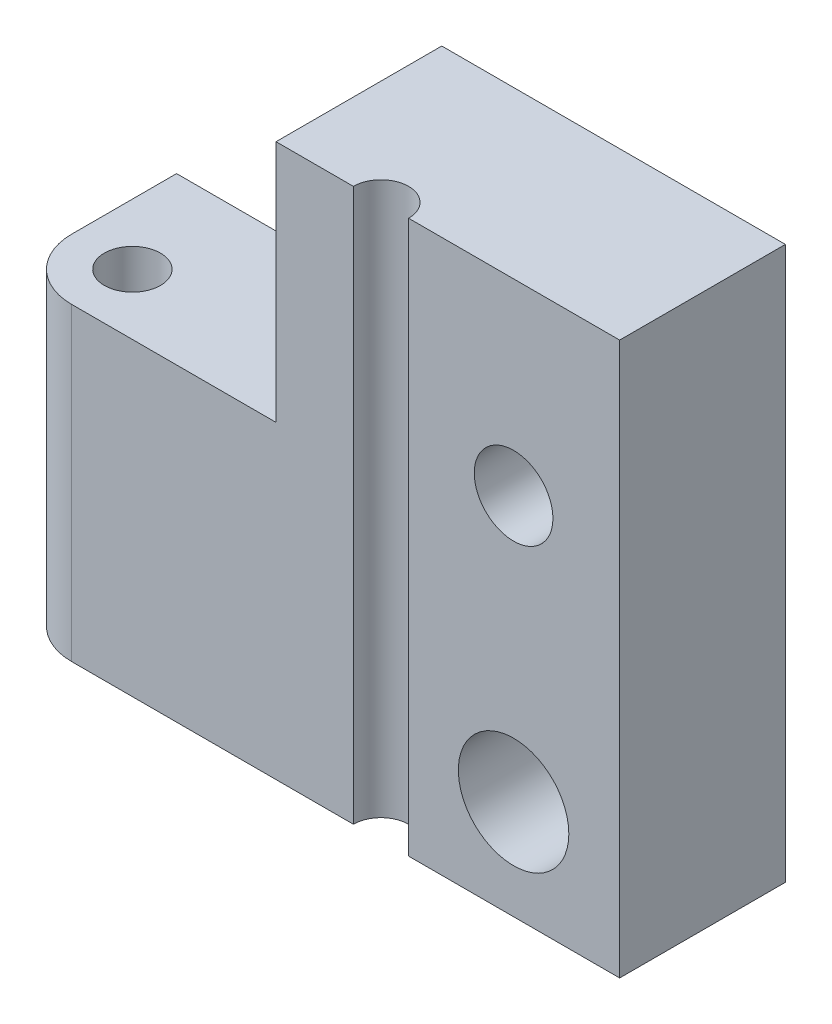
ISO-10303-21;
HEADER;
FILE_DESCRIPTION(('STEP AP214'),'2;1');
FILE_NAME('part.step','',(''),(''),'','','');
FILE_SCHEMA(('AUTOMOTIVE_DESIGN { 1 0 10303 214 1 1 1 1 }'));
ENDSEC;
DATA;
#1=APPLICATION_CONTEXT('core data for automotive mechanical design processes');
#2=APPLICATION_PROTOCOL_DEFINITION('international standard','automotive_design',2000,#1);
#3=PRODUCT_CONTEXT('',#1,'mechanical');
#4=PRODUCT('Part','Part','',(#3));
#5=PRODUCT_RELATED_PRODUCT_CATEGORY('part','',(#4));
#6=PRODUCT_DEFINITION_FORMATION('','',#4);
#7=PRODUCT_DEFINITION_CONTEXT('part definition',#1,'design');
#8=PRODUCT_DEFINITION('design','',#6,#7);
#9=PRODUCT_DEFINITION_SHAPE('','',#8);
#10=(LENGTH_UNIT() NAMED_UNIT(*) SI_UNIT(.MILLI.,.METRE.));
#11=(NAMED_UNIT(*) PLANE_ANGLE_UNIT() SI_UNIT($,.RADIAN.));
#12=(NAMED_UNIT(*) SI_UNIT($,.STERADIAN.) SOLID_ANGLE_UNIT());
#13=UNCERTAINTY_MEASURE_WITH_UNIT(LENGTH_MEASURE(1.E-05),#10,'distance_accuracy_value','');
#14=(GEOMETRIC_REPRESENTATION_CONTEXT(3) GLOBAL_UNCERTAINTY_ASSIGNED_CONTEXT((#13)) GLOBAL_UNIT_ASSIGNED_CONTEXT((#10,
#11,#12)) REPRESENTATION_CONTEXT('',''));
#15=CARTESIAN_POINT('',(0.,0.,0.));
#16=DIRECTION('',(0.,0.,1.));
#17=DIRECTION('',(1.,0.,0.));
#18=AXIS2_PLACEMENT_3D('',#15,#16,#17);
#19=CARTESIAN_POINT('',(17.49425,15.875,0.));
#20=DIRECTION('',(-1.,0.,0.));
#21=DIRECTION('',(0.,0.,1.));
#22=AXIS2_PLACEMENT_3D('',#19,#20,#21);
#23=PLANE('',#22);
#24=DIRECTION('',(0.,0.,-1.));
#25=VECTOR('',#24,1.);
#26=CARTESIAN_POINT('',(17.49425,0.,0.));
#27=LINE('',#26,#25);
#28=CARTESIAN_POINT('',(17.49425,0.,0.));
#29=VERTEX_POINT('',#28);
#30=CARTESIAN_POINT('',(17.49425,0.,-4.7625));
#31=VERTEX_POINT('',#30);
#32=EDGE_CURVE('E119',#29,#31,#27,.T.);
#33=ORIENTED_EDGE('',*,*,#32,.T.);
#34=DIRECTION('',(0.,-1.,0.));
#35=VECTOR('',#34,1.);
#36=CARTESIAN_POINT('',(17.49425,15.875,-4.7625));
#37=LINE('',#36,#35);
#38=CARTESIAN_POINT('',(17.49425,15.875,-4.7625));
#39=VERTEX_POINT('',#38);
#40=EDGE_CURVE('E123',#39,#31,#37,.T.);
#41=ORIENTED_EDGE('',*,*,#40,.F.);
#42=DIRECTION('',(0.,0.,-1.));
#43=VECTOR('',#42,1.);
#44=CARTESIAN_POINT('',(17.49425,15.875,0.));
#45=LINE('',#44,#43);
#46=CARTESIAN_POINT('',(17.49425,15.875,0.));
#47=VERTEX_POINT('',#46);
#48=EDGE_CURVE('E196',#47,#39,#45,.T.);
#49=ORIENTED_EDGE('',*,*,#48,.F.);
#50=DIRECTION('',(0.,-1.,0.));
#51=VECTOR('',#50,1.);
#52=CARTESIAN_POINT('',(17.49425,15.875,0.));
#53=LINE('',#52,#51);
#54=EDGE_CURVE('E124',#47,#29,#53,.T.);
#55=ORIENTED_EDGE('',*,*,#54,.T.);
#56=EDGE_LOOP('',(#33,#41,#49,#55));
#57=FACE_BOUND('',#56,.T.);
#58=ADVANCED_FACE('F40',(#57),#23,.F.);
#59=CARTESIAN_POINT('',(0.,15.875,-1.74625));
#60=DIRECTION('',(1.,0.,0.));
#61=DIRECTION('',(0.,0.,-1.));
#62=AXIS2_PLACEMENT_3D('',#59,#60,#61);
#63=PLANE('',#62);
#64=DIRECTION('',(0.,-1.,0.));
#65=VECTOR('',#64,1.);
#66=CARTESIAN_POINT('',(0.,15.875,-1.74625));
#67=LINE('',#66,#65);
#68=CARTESIAN_POINT('',(0.,8.89,-1.74625));
#69=VERTEX_POINT('',#68);
#70=CARTESIAN_POINT('',(0.,0.,-1.74625));
#71=VERTEX_POINT('',#70);
#72=EDGE_CURVE('E11',#69,#71,#67,.T.);
#73=ORIENTED_EDGE('',*,*,#72,.F.);
#74=DIRECTION('',(0.,0.,-1.));
#75=VECTOR('',#74,1.);
#76=CARTESIAN_POINT('',(0.,8.89,0.));
#77=LINE('',#76,#75);
#78=CARTESIAN_POINT('',(0.,8.89,-4.7625));
#79=VERTEX_POINT('',#78);
#80=EDGE_CURVE('E181',#69,#79,#77,.T.);
#81=ORIENTED_EDGE('',*,*,#80,.T.);
#82=DIRECTION('',(0.,1.,0.));
#83=VECTOR('',#82,1.);
#84=CARTESIAN_POINT('',(0.,0.,-4.7625));
#85=LINE('',#84,#83);
#86=CARTESIAN_POINT('',(0.,0.,-4.7625));
#87=VERTEX_POINT('',#86);
#88=EDGE_CURVE('E139',#87,#79,#85,.T.);
#89=ORIENTED_EDGE('',*,*,#88,.F.);
#90=DIRECTION('',(0.,0.,1.));
#91=VECTOR('',#90,1.);
#92=CARTESIAN_POINT('',(0.,0.,-1.74625));
#93=LINE('',#92,#91);
#94=EDGE_CURVE('E127',#87,#71,#93,.T.);
#95=ORIENTED_EDGE('',*,*,#94,.T.);
#96=EDGE_LOOP('',(#73,#81,#89,#95));
#97=FACE_BOUND('',#96,.T.);
#98=ADVANCED_FACE('F251',(#97),#63,.F.);
#99=CARTESIAN_POINT('',(1.74625,15.875,-1.74625));
#100=DIRECTION('',(0.,-1.,0.));
#101=DIRECTION('',(0.,0.,-1.));
#102=AXIS2_PLACEMENT_3D('',#99,#100,#101);
#103=CYLINDRICAL_SURFACE('',#102,1.74625);
#104=DIRECTION('',(0.,-1.,0.));
#105=VECTOR('',#104,1.);
#106=CARTESIAN_POINT('',(1.74625,15.875,0.));
#107=LINE('',#106,#105);
#108=CARTESIAN_POINT('',(1.74625,8.89,0.));
#109=VERTEX_POINT('',#108);
#110=CARTESIAN_POINT('',(1.74625,0.,0.));
#111=VERTEX_POINT('',#110);
#112=EDGE_CURVE('E49',#109,#111,#107,.T.);
#113=ORIENTED_EDGE('',*,*,#112,.F.);
#114=CARTESIAN_POINT('',(1.74625,8.89,-1.74625));
#115=DIRECTION('',(0.,-1.,0.));
#116=DIRECTION('',(1.,0.,0.));
#117=AXIS2_PLACEMENT_3D('',#114,#115,#116);
#118=CIRCLE('',#117,1.74625);
#119=EDGE_CURVE('E189',#109,#69,#118,.T.);
#120=ORIENTED_EDGE('',*,*,#119,.T.);
#121=ORIENTED_EDGE('',*,*,#72,.T.);
#122=CARTESIAN_POINT('',(1.74625,0.,-1.74625));
#123=DIRECTION('',(0.,1.,0.));
#124=DIRECTION('',(0.,0.,1.));
#125=AXIS2_PLACEMENT_3D('',#122,#123,#124);
#126=CIRCLE('',#125,1.74625);
#127=EDGE_CURVE('E208',#71,#111,#126,.T.);
#128=ORIENTED_EDGE('',*,*,#127,.T.);
#129=EDGE_LOOP('',(#113,#120,#121,#128));
#130=FACE_BOUND('',#129,.T.);
#131=ADVANCED_FACE('F236',(#130),#103,.T.);
#132=CARTESIAN_POINT('',(1.74625,15.875,0.));
#133=DIRECTION('',(0.,0.,-1.));
#134=DIRECTION('',(-1.,0.,0.));
#135=AXIS2_PLACEMENT_3D('',#132,#133,#134);
#136=PLANE('',#135);
#137=DIRECTION('',(0.,-1.,0.));
#138=VECTOR('',#137,1.);
#139=CARTESIAN_POINT('',(7.62,15.875,0.));
#140=LINE('',#139,#138);
#141=CARTESIAN_POINT('',(7.62,15.875,0.));
#142=VERTEX_POINT('',#141);
#143=CARTESIAN_POINT('',(7.62,8.89,0.));
#144=VERTEX_POINT('',#143);
#145=EDGE_CURVE('E56',#142,#144,#140,.T.);
#146=ORIENTED_EDGE('',*,*,#145,.T.);
#147=DIRECTION('',(-1.,0.,0.));
#148=VECTOR('',#147,1.);
#149=CARTESIAN_POINT('',(0.,8.89,0.));
#150=LINE('',#149,#148);
#151=EDGE_CURVE('E176',#144,#109,#150,.T.);
#152=ORIENTED_EDGE('',*,*,#151,.T.);
#153=ORIENTED_EDGE('',*,*,#112,.T.);
#154=DIRECTION('',(1.,0.,0.));
#155=VECTOR('',#154,1.);
#156=CARTESIAN_POINT('',(1.74625,0.,0.));
#157=LINE('',#156,#155);
#158=CARTESIAN_POINT('',(9.8425,0.,0.));
#159=VERTEX_POINT('',#158);
#160=EDGE_CURVE('E212',#111,#159,#157,.T.);
#161=ORIENTED_EDGE('',*,*,#160,.T.);
#162=DIRECTION('',(0.,-1.,0.));
#163=VECTOR('',#162,1.);
#164=CARTESIAN_POINT('',(9.8425,15.875,0.));
#165=LINE('',#164,#163);
#166=CARTESIAN_POINT('',(9.8425,15.875,0.));
#167=VERTEX_POINT('',#166);
#168=EDGE_CURVE('E225',#167,#159,#165,.T.);
#169=ORIENTED_EDGE('',*,*,#168,.F.);
#170=DIRECTION('',(1.,0.,0.));
#171=VECTOR('',#170,1.);
#172=CARTESIAN_POINT('',(1.74625,15.875,0.));
#173=LINE('',#172,#171);
#174=EDGE_CURVE('E91',#142,#167,#173,.T.);
#175=ORIENTED_EDGE('',*,*,#174,.F.);
#176=EDGE_LOOP('',(#146,#152,#153,#161,#169,#175));
#177=FACE_BOUND('',#176,.T.);
#178=ADVANCED_FACE('F232',(#177),#136,.F.);
#179=CARTESIAN_POINT('',(10.63625,15.875,0.));
#180=DIRECTION('',(0.,-1.,0.));
#181=DIRECTION('',(0.,0.,-1.));
#182=AXIS2_PLACEMENT_3D('',#179,#180,#181);
#183=CYLINDRICAL_SURFACE('',#182,0.793749999999999);
#184=CARTESIAN_POINT('',(10.63625,0.,0.));
#185=DIRECTION('',(0.,-1.,0.));
#186=DIRECTION('',(0.,0.,-1.));
#187=AXIS2_PLACEMENT_3D('',#184,#185,#186);
#188=CIRCLE('',#187,0.793749999999999);
#189=CARTESIAN_POINT('',(11.43,0.,0.));
#190=VERTEX_POINT('',#189);
#191=EDGE_CURVE('E215',#159,#190,#188,.T.);
#192=ORIENTED_EDGE('',*,*,#191,.T.);
#193=DIRECTION('',(0.,-1.,0.));
#194=VECTOR('',#193,1.);
#195=CARTESIAN_POINT('',(11.43,15.875,0.));
#196=LINE('',#195,#194);
#197=CARTESIAN_POINT('',(11.43,15.875,0.));
#198=VERTEX_POINT('',#197);
#199=EDGE_CURVE('E222',#198,#190,#196,.T.);
#200=ORIENTED_EDGE('',*,*,#199,.F.);
#201=CARTESIAN_POINT('',(10.63625,15.875,0.));
#202=DIRECTION('',(0.,-1.,0.));
#203=DIRECTION('',(0.,0.,-1.));
#204=AXIS2_PLACEMENT_3D('',#201,#202,#203);
#205=CIRCLE('',#204,0.793749999999999);
#206=EDGE_CURVE('E201',#167,#198,#205,.T.);
#207=ORIENTED_EDGE('',*,*,#206,.F.);
#208=ORIENTED_EDGE('',*,*,#168,.T.);
#209=EDGE_LOOP('',(#192,#200,#207,#208));
#210=FACE_BOUND('',#209,.T.);
#211=ADVANCED_FACE('F241',(#210),#183,.F.);
#212=CARTESIAN_POINT('',(11.43,15.875,0.));
#213=DIRECTION('',(0.,0.,-1.));
#214=DIRECTION('',(-1.,0.,0.));
#215=AXIS2_PLACEMENT_3D('',#212,#213,#214);
#216=PLANE('',#215);
#217=CARTESIAN_POINT('',(14.44625,10.4775,0.));
#218=DIRECTION('',(0.,0.,1.));
#219=DIRECTION('',(1.,0.,0.));
#220=AXIS2_PLACEMENT_3D('',#217,#218,#219);
#221=CIRCLE('',#220,1.1303);
#222=CARTESIAN_POINT('',(15.57655,10.4775,0.));
#223=VERTEX_POINT('',#222);
#224=EDGE_CURVE('E151',#223,#223,#221,.T.);
#225=ORIENTED_EDGE('',*,*,#224,.F.);
#226=EDGE_LOOP('',(#225));
#227=FACE_BOUND('',#226,.T.);
#228=CARTESIAN_POINT('',(14.44625,2.8575,0.));
#229=DIRECTION('',(0.,0.,1.));
#230=DIRECTION('',(1.,0.,0.));
#231=AXIS2_PLACEMENT_3D('',#228,#229,#230);
#232=CIRCLE('',#231,1.5875);
#233=CARTESIAN_POINT('',(16.03375,2.8575,0.));
#234=VERTEX_POINT('',#233);
#235=EDGE_CURVE('E166',#234,#234,#232,.T.);
#236=ORIENTED_EDGE('',*,*,#235,.F.);
#237=EDGE_LOOP('',(#236));
#238=FACE_BOUND('',#237,.T.);
#239=DIRECTION('',(1.,0.,0.));
#240=VECTOR('',#239,1.);
#241=CARTESIAN_POINT('',(11.43,0.,0.));
#242=LINE('',#241,#240);
#243=EDGE_CURVE('E87',#190,#29,#242,.T.);
#244=ORIENTED_EDGE('',*,*,#243,.T.);
#245=ORIENTED_EDGE('',*,*,#54,.F.);
#246=DIRECTION('',(1.,0.,0.));
#247=VECTOR('',#246,1.);
#248=CARTESIAN_POINT('',(11.43,15.875,0.));
#249=LINE('',#248,#247);
#250=EDGE_CURVE('E65',#198,#47,#249,.T.);
#251=ORIENTED_EDGE('',*,*,#250,.F.);
#252=ORIENTED_EDGE('',*,*,#199,.T.);
#253=EDGE_LOOP('',(#244,#245,#251,#252));
#254=FACE_BOUND('',#253,.T.);
#255=ADVANCED_FACE('F243',(#227,#238,#254),#216,.F.);
#256=CARTESIAN_POINT('',(1.74625,15.875,-1.74625));
#257=DIRECTION('',(0.,1.,0.));
#258=DIRECTION('',(0.,0.,1.));
#259=AXIS2_PLACEMENT_3D('',#256,#257,#258);
#260=PLANE('',#259);
#261=DIRECTION('',(0.,0.,-1.));
#262=VECTOR('',#261,1.);
#263=CARTESIAN_POINT('',(7.62,15.875,0.));
#264=LINE('',#263,#262);
#265=CARTESIAN_POINT('',(7.62,15.875,-4.7625));
#266=VERTEX_POINT('',#265);
#267=EDGE_CURVE('E180',#142,#266,#264,.T.);
#268=ORIENTED_EDGE('',*,*,#267,.F.);
#269=ORIENTED_EDGE('',*,*,#174,.T.);
#270=ORIENTED_EDGE('',*,*,#206,.T.);
#271=ORIENTED_EDGE('',*,*,#250,.T.);
#272=ORIENTED_EDGE('',*,*,#48,.T.);
#273=DIRECTION('',(1.,0.,0.));
#274=VECTOR('',#273,1.);
#275=CARTESIAN_POINT('',(7.62,15.875,-4.7625));
#276=LINE('',#275,#274);
#277=EDGE_CURVE('E145',#266,#39,#276,.T.);
#278=ORIENTED_EDGE('',*,*,#277,.F.);
#279=EDGE_LOOP('',(#268,#269,#270,#271,#272,#278));
#280=FACE_BOUND('',#279,.T.);
#281=ADVANCED_FACE('F244',(#280),#260,.T.);
#282=CARTESIAN_POINT('',(1.74625,0.,-1.74625));
#283=DIRECTION('',(0.,1.,0.));
#284=DIRECTION('',(0.,0.,1.));
#285=AXIS2_PLACEMENT_3D('',#282,#283,#284);
#286=PLANE('',#285);
#287=CARTESIAN_POINT('',(1.74625,0.,-1.74625));
#288=DIRECTION('',(0.,1.,0.));
#289=DIRECTION('',(0.,0.,1.));
#290=AXIS2_PLACEMENT_3D('',#287,#288,#289);
#291=CIRCLE('',#290,0.806449999999997);
#292=CARTESIAN_POINT('',(1.74625,0.,-0.939800000000003));
#293=VERTEX_POINT('',#292);
#294=EDGE_CURVE('E128',#293,#293,#291,.T.);
#295=ORIENTED_EDGE('',*,*,#294,.T.);
#296=EDGE_LOOP('',(#295));
#297=FACE_BOUND('',#296,.T.);
#298=ORIENTED_EDGE('',*,*,#32,.F.);
#299=ORIENTED_EDGE('',*,*,#243,.F.);
#300=ORIENTED_EDGE('',*,*,#191,.F.);
#301=ORIENTED_EDGE('',*,*,#160,.F.);
#302=ORIENTED_EDGE('',*,*,#127,.F.);
#303=ORIENTED_EDGE('',*,*,#94,.F.);
#304=DIRECTION('',(-1.,0.,0.));
#305=VECTOR('',#304,1.);
#306=CARTESIAN_POINT('',(17.49425,0.,-4.7625));
#307=LINE('',#306,#305);
#308=EDGE_CURVE('E131',#31,#87,#307,.T.);
#309=ORIENTED_EDGE('',*,*,#308,.F.);
#310=EDGE_LOOP('',(#298,#299,#300,#301,#302,#303,#309));
#311=FACE_BOUND('',#310,.T.);
#312=ADVANCED_FACE('F132',(#297,#311),#286,.F.);
#313=CARTESIAN_POINT('',(1.74625,15.875,-1.74625));
#314=DIRECTION('',(0.,1.,0.));
#315=DIRECTION('',(0.,0.,1.));
#316=AXIS2_PLACEMENT_3D('',#313,#314,#315);
#317=CYLINDRICAL_SURFACE('',#316,0.806449999999992);
#318=CARTESIAN_POINT('',(1.74625,8.89,-1.74625));
#319=DIRECTION('',(0.,-1.,0.));
#320=DIRECTION('',(1.,0.,0.));
#321=AXIS2_PLACEMENT_3D('',#318,#319,#320);
#322=CIRCLE('',#321,0.806449999999992);
#323=CARTESIAN_POINT('',(2.55269999999999,8.89,-1.74625));
#324=VERTEX_POINT('',#323);
#325=EDGE_CURVE('E43',#324,#324,#322,.F.);
#326=ORIENTED_EDGE('',*,*,#325,.T.);
#327=EDGE_LOOP('',(#326));
#328=FACE_BOUND('',#327,.T.);
#329=ORIENTED_EDGE('',*,*,#294,.F.);
#330=EDGE_LOOP('',(#329));
#331=FACE_BOUND('',#330,.T.);
#332=ADVANCED_FACE('F268',(#328,#331),#317,.F.);
#333=CARTESIAN_POINT('',(0.,8.89,0.));
#334=DIRECTION('',(0.,-1.,0.));
#335=DIRECTION('',(1.,0.,0.));
#336=AXIS2_PLACEMENT_3D('',#333,#334,#335);
#337=PLANE('',#336);
#338=ORIENTED_EDGE('',*,*,#325,.F.);
#339=EDGE_LOOP('',(#338));
#340=FACE_BOUND('',#339,.T.);
#341=ORIENTED_EDGE('',*,*,#151,.F.);
#342=DIRECTION('',(0.,0.,-1.));
#343=VECTOR('',#342,1.);
#344=CARTESIAN_POINT('',(7.62,8.89,0.));
#345=LINE('',#344,#343);
#346=CARTESIAN_POINT('',(7.62,8.89,-4.7625));
#347=VERTEX_POINT('',#346);
#348=EDGE_CURVE('E184',#144,#347,#345,.T.);
#349=ORIENTED_EDGE('',*,*,#348,.T.);
#350=DIRECTION('',(1.,0.,0.));
#351=VECTOR('',#350,1.);
#352=CARTESIAN_POINT('',(0.,8.89,-4.7625));
#353=LINE('',#352,#351);
#354=EDGE_CURVE('E157',#79,#347,#353,.T.);
#355=ORIENTED_EDGE('',*,*,#354,.F.);
#356=ORIENTED_EDGE('',*,*,#80,.F.);
#357=ORIENTED_EDGE('',*,*,#119,.F.);
#358=EDGE_LOOP('',(#341,#349,#355,#356,#357));
#359=FACE_BOUND('',#358,.T.);
#360=ADVANCED_FACE('F249',(#340,#359),#337,.F.);
#361=CARTESIAN_POINT('',(7.62,15.875,0.));
#362=DIRECTION('',(1.,0.,0.));
#363=DIRECTION('',(0.,1.,0.));
#364=AXIS2_PLACEMENT_3D('',#361,#362,#363);
#365=PLANE('',#364);
#366=ORIENTED_EDGE('',*,*,#267,.T.);
#367=DIRECTION('',(0.,1.,0.));
#368=VECTOR('',#367,1.);
#369=CARTESIAN_POINT('',(7.62,8.89,-4.7625));
#370=LINE('',#369,#368);
#371=EDGE_CURVE('E161',#347,#266,#370,.T.);
#372=ORIENTED_EDGE('',*,*,#371,.F.);
#373=ORIENTED_EDGE('',*,*,#348,.F.);
#374=ORIENTED_EDGE('',*,*,#145,.F.);
#375=EDGE_LOOP('',(#366,#372,#373,#374));
#376=FACE_BOUND('',#375,.T.);
#377=ADVANCED_FACE('F246',(#376),#365,.F.);
#378=CARTESIAN_POINT('',(14.44625,2.8575,-3.302));
#379=DIRECTION('',(0.,0.,1.));
#380=DIRECTION('',(1.,0.,0.));
#381=AXIS2_PLACEMENT_3D('',#378,#379,#380);
#382=CYLINDRICAL_SURFACE('',#381,1.5875);
#383=CARTESIAN_POINT('',(14.44625,2.8575,-3.175));
#384=DIRECTION('',(0.,0.,1.));
#385=DIRECTION('',(1.,0.,0.));
#386=AXIS2_PLACEMENT_3D('',#383,#384,#385);
#387=CIRCLE('',#386,1.5875);
#388=CARTESIAN_POINT('',(16.03375,2.8575,-3.175));
#389=VERTEX_POINT('',#388);
#390=EDGE_CURVE('E170',#389,#389,#387,.T.);
#391=CARTESIAN_POINT('',(16.03375,2.8575,0.));
#392=CARTESIAN_POINT('',(16.03375,2.8575,-0.0330729166666666));
#393=CARTESIAN_POINT('',(16.03375,2.8575,-0.0661458333333333));
#394=CARTESIAN_POINT('',(16.03375,2.8575,-0.132291666666667));
#395=CARTESIAN_POINT('',(16.03375,2.8575,-0.165364583333333));
#396=CARTESIAN_POINT('',(16.03375,2.8575,-0.231510416666667));
#397=CARTESIAN_POINT('',(16.03375,2.8575,-0.264583333333333));
#398=CARTESIAN_POINT('',(16.03375,2.8575,-0.330729166666667));
#399=CARTESIAN_POINT('',(16.03375,2.8575,-0.363802083333333));
#400=CARTESIAN_POINT('',(16.03375,2.8575,-0.429947916666667));
#401=CARTESIAN_POINT('',(16.03375,2.8575,-0.463020833333333));
#402=CARTESIAN_POINT('',(16.03375,2.8575,-0.529166666666667));
#403=CARTESIAN_POINT('',(16.03375,2.8575,-0.562239583333334));
#404=CARTESIAN_POINT('',(16.03375,2.8575,-0.628385416666667));
#405=CARTESIAN_POINT('',(16.03375,2.8575,-0.661458333333334));
#406=CARTESIAN_POINT('',(16.03375,2.8575,-0.727604166666667));
#407=CARTESIAN_POINT('',(16.03375,2.8575,-0.760677083333334));
#408=CARTESIAN_POINT('',(16.03375,2.8575,-0.826822916666667));
#409=CARTESIAN_POINT('',(16.03375,2.8575,-0.859895833333334));
#410=CARTESIAN_POINT('',(16.03375,2.8575,-0.926041666666667));
#411=CARTESIAN_POINT('',(16.03375,2.8575,-0.959114583333333));
#412=CARTESIAN_POINT('',(16.03375,2.8575,-1.02526041666667));
#413=CARTESIAN_POINT('',(16.03375,2.8575,-1.05833333333333));
#414=CARTESIAN_POINT('',(16.03375,2.8575,-1.12447916666667));
#415=CARTESIAN_POINT('',(16.03375,2.8575,-1.15755208333333));
#416=CARTESIAN_POINT('',(16.03375,2.8575,-1.22369791666667));
#417=CARTESIAN_POINT('',(16.03375,2.8575,-1.25677083333333));
#418=CARTESIAN_POINT('',(16.03375,2.8575,-1.32291666666667));
#419=CARTESIAN_POINT('',(16.03375,2.8575,-1.35598958333333));
#420=CARTESIAN_POINT('',(16.03375,2.8575,-1.42213541666667));
#421=CARTESIAN_POINT('',(16.03375,2.8575,-1.45520833333333));
#422=CARTESIAN_POINT('',(16.03375,2.8575,-1.52135416666667));
#423=CARTESIAN_POINT('',(16.03375,2.8575,-1.55442708333333));
#424=CARTESIAN_POINT('',(16.03375,2.8575,-1.62057291666667));
#425=CARTESIAN_POINT('',(16.03375,2.8575,-1.65364583333333));
#426=CARTESIAN_POINT('',(16.03375,2.8575,-1.71979166666667));
#427=CARTESIAN_POINT('',(16.03375,2.8575,-1.75286458333333));
#428=CARTESIAN_POINT('',(16.03375,2.8575,-1.81901041666667));
#429=CARTESIAN_POINT('',(16.03375,2.8575,-1.85208333333333));
#430=CARTESIAN_POINT('',(16.03375,2.8575,-1.91822916666667));
#431=CARTESIAN_POINT('',(16.03375,2.8575,-1.95130208333333));
#432=CARTESIAN_POINT('',(16.03375,2.8575,-2.01744791666667));
#433=CARTESIAN_POINT('',(16.03375,2.8575,-2.05052083333333));
#434=CARTESIAN_POINT('',(16.03375,2.8575,-2.11666666666667));
#435=CARTESIAN_POINT('',(16.03375,2.8575,-2.14973958333333));
#436=CARTESIAN_POINT('',(16.03375,2.8575,-2.21588541666667));
#437=CARTESIAN_POINT('',(16.03375,2.8575,-2.24895833333333));
#438=CARTESIAN_POINT('',(16.03375,2.8575,-2.31510416666667));
#439=CARTESIAN_POINT('',(16.03375,2.8575,-2.34817708333333));
#440=CARTESIAN_POINT('',(16.03375,2.8575,-2.41432291666667));
#441=CARTESIAN_POINT('',(16.03375,2.8575,-2.44739583333333));
#442=CARTESIAN_POINT('',(16.03375,2.8575,-2.51354166666667));
#443=CARTESIAN_POINT('',(16.03375,2.8575,-2.54661458333333));
#444=CARTESIAN_POINT('',(16.03375,2.8575,-2.61276041666667));
#445=CARTESIAN_POINT('',(16.03375,2.8575,-2.64583333333333));
#446=CARTESIAN_POINT('',(16.03375,2.8575,-2.71197916666667));
#447=CARTESIAN_POINT('',(16.03375,2.8575,-2.74505208333333));
#448=CARTESIAN_POINT('',(16.03375,2.8575,-2.81119791666667));
#449=CARTESIAN_POINT('',(16.03375,2.8575,-2.84427083333333));
#450=CARTESIAN_POINT('',(16.03375,2.8575,-2.91041666666667));
#451=CARTESIAN_POINT('',(16.03375,2.8575,-2.94348958333333));
#452=CARTESIAN_POINT('',(16.03375,2.8575,-3.00963541666667));
#453=CARTESIAN_POINT('',(16.03375,2.8575,-3.04270833333333));
#454=CARTESIAN_POINT('',(16.03375,2.8575,-3.10885416666667));
#455=CARTESIAN_POINT('',(16.03375,2.8575,-3.14192708333333));
#456=CARTESIAN_POINT('',(16.03375,2.8575,-3.175));
#457=B_SPLINE_CURVE_WITH_KNOTS('',3,(#391,#392,#393,#394,#395,#396,#397,#398,#399,#400,#401,
#402,#403,#404,#405,#406,#407,#408,#409,#410,#411,#412,#413,#414,#415,#416,#417,#418,#419,#420,
#421,#422,#423,#424,#425,#426,#427,#428,#429,#430,#431,#432,#433,#434,#435,#436,#437,#438,#439,
#440,#441,#442,#443,#444,#445,#446,#447,#448,#449,#450,#451,#452,#453,#454,#455,#456),
.UNSPECIFIED.,.F.,.F.,(4,2,2,2,2,2,2,2,2,2,2,2,2,2,2,2,2,2,2,2,2,2,2,2,2,2,2,2,2,2,2,2,4),(0.,
0.0992187499999999,0.1984375,0.29765625,0.396875,0.49609375,0.5953125,0.69453125,0.79375,
0.89296875,0.9921875,1.09140625,1.190625,1.28984375,1.3890625,1.48828125,1.5875,1.68671875,
1.7859375,1.88515625,1.984375,2.08359375,2.1828125,2.28203125,2.38125,2.48046875,2.5796875,
2.67890625,2.778125,2.87734375,2.9765625,3.07578125,3.175),.UNSPECIFIED.);
#458=EDGE_CURVE('BSEAM277',#234,#389,#457,.T.);
#459=ORIENTED_EDGE('',*,*,#235,.T.);
#460=ORIENTED_EDGE('',*,*,#390,.F.);
#461=ORIENTED_EDGE('',*,*,#458,.T.);
#462=ORIENTED_EDGE('',*,*,#458,.F.);
#463=EDGE_LOOP('',(#459,#461,#460,#462));
#464=FACE_BOUND('',#463,.T.);
#465=ADVANCED_FACE('F277',(#464),#382,.F.);
#466=CARTESIAN_POINT('',(0.,0.,-3.175));
#467=DIRECTION('',(0.,0.,-1.));
#468=DIRECTION('',(-1.,0.,0.));
#469=AXIS2_PLACEMENT_3D('',#466,#467,#468);
#470=PLANE('',#469);
#471=CARTESIAN_POINT('',(14.44625,2.8575,-3.175));
#472=DIRECTION('',(0.,0.,1.));
#473=DIRECTION('',(1.,0.,0.));
#474=AXIS2_PLACEMENT_3D('',#471,#472,#473);
#475=CIRCLE('',#474,0.793749999999987);
#476=CARTESIAN_POINT('',(15.24,2.8575,-3.175));
#477=VERTEX_POINT('',#476);
#478=EDGE_CURVE('E306',#477,#477,#475,.T.);
#479=ORIENTED_EDGE('',*,*,#478,.F.);
#480=EDGE_LOOP('',(#479));
#481=FACE_BOUND('',#480,.T.);
#482=ORIENTED_EDGE('',*,*,#390,.T.);
#483=EDGE_LOOP('',(#482));
#484=FACE_BOUND('',#483,.T.);
#485=ADVANCED_FACE('F283',(#481,#484),#470,.F.);
#486=CARTESIAN_POINT('',(0.,0.,-4.7625));
#487=DIRECTION('',(0.,0.,-1.));
#488=DIRECTION('',(-1.,0.,0.));
#489=AXIS2_PLACEMENT_3D('',#486,#487,#488);
#490=PLANE('',#489);
#491=CARTESIAN_POINT('',(14.44625,2.8575,-4.7625));
#492=DIRECTION('',(0.,0.,1.));
#493=DIRECTION('',(1.,0.,0.));
#494=AXIS2_PLACEMENT_3D('',#491,#492,#493);
#495=CIRCLE('',#494,0.793749999999998);
#496=CARTESIAN_POINT('',(15.24,2.8575,-4.7625));
#497=VERTEX_POINT('',#496);
#498=EDGE_CURVE('E303',#497,#497,#495,.T.);
#499=ORIENTED_EDGE('',*,*,#498,.T.);
#500=EDGE_LOOP('',(#499));
#501=FACE_BOUND('',#500,.T.);
#502=CARTESIAN_POINT('',(14.44625,10.4775,-4.7625));
#503=DIRECTION('',(0.,0.,1.));
#504=DIRECTION('',(1.,0.,0.));
#505=AXIS2_PLACEMENT_3D('',#502,#503,#504);
#506=CIRCLE('',#505,1.1303);
#507=CARTESIAN_POINT('',(15.57655,10.4775,-4.7625));
#508=VERTEX_POINT('',#507);
#509=EDGE_CURVE('E147',#508,#508,#506,.T.);
#510=ORIENTED_EDGE('',*,*,#509,.T.);
#511=EDGE_LOOP('',(#510));
#512=FACE_BOUND('',#511,.T.);
#513=ORIENTED_EDGE('',*,*,#40,.T.);
#514=ORIENTED_EDGE('',*,*,#308,.T.);
#515=ORIENTED_EDGE('',*,*,#88,.T.);
#516=ORIENTED_EDGE('',*,*,#354,.T.);
#517=ORIENTED_EDGE('',*,*,#371,.T.);
#518=ORIENTED_EDGE('',*,*,#277,.T.);
#519=EDGE_LOOP('',(#513,#514,#515,#516,#517,#518));
#520=FACE_BOUND('',#519,.T.);
#521=ADVANCED_FACE('F142',(#501,#512,#520),#490,.T.);
#522=CARTESIAN_POINT('',(14.44625,10.4775,0.));
#523=DIRECTION('',(0.,0.,1.));
#524=DIRECTION('',(1.,0.,0.));
#525=AXIS2_PLACEMENT_3D('',#522,#523,#524);
#526=CYLINDRICAL_SURFACE('',#525,1.1303);
#527=ORIENTED_EDGE('',*,*,#509,.F.);
#528=EDGE_LOOP('',(#527));
#529=FACE_BOUND('',#528,.T.);
#530=ORIENTED_EDGE('',*,*,#224,.T.);
#531=EDGE_LOOP('',(#530));
#532=FACE_BOUND('',#531,.T.);
#533=ADVANCED_FACE('F290',(#529,#532),#526,.F.);
#534=CARTESIAN_POINT('',(14.44625,2.8575,-3.175));
#535=DIRECTION('',(0.,0.,1.));
#536=DIRECTION('',(1.,0.,0.));
#537=AXIS2_PLACEMENT_3D('',#534,#535,#536);
#538=CYLINDRICAL_SURFACE('',#537,0.793749999999992);
#539=ORIENTED_EDGE('',*,*,#498,.F.);
#540=EDGE_LOOP('',(#539));
#541=FACE_BOUND('',#540,.T.);
#542=ORIENTED_EDGE('',*,*,#478,.T.);
#543=EDGE_LOOP('',(#542));
#544=FACE_BOUND('',#543,.T.);
#545=ADVANCED_FACE('F294',(#541,#544),#538,.F.);
#546=CLOSED_SHELL('',(#58,#98,#131,#178,#211,#255,#281,#312,#332,#360,#377,#465,#485,#521,#533,#545));
#547=MANIFOLD_SOLID_BREP('B2',#546);
#548=ADVANCED_BREP_SHAPE_REPRESENTATION('',(#18,#547),#14);
#549=SHAPE_DEFINITION_REPRESENTATION(#9,#548);
ENDSEC;
END-ISO-10303-21;
